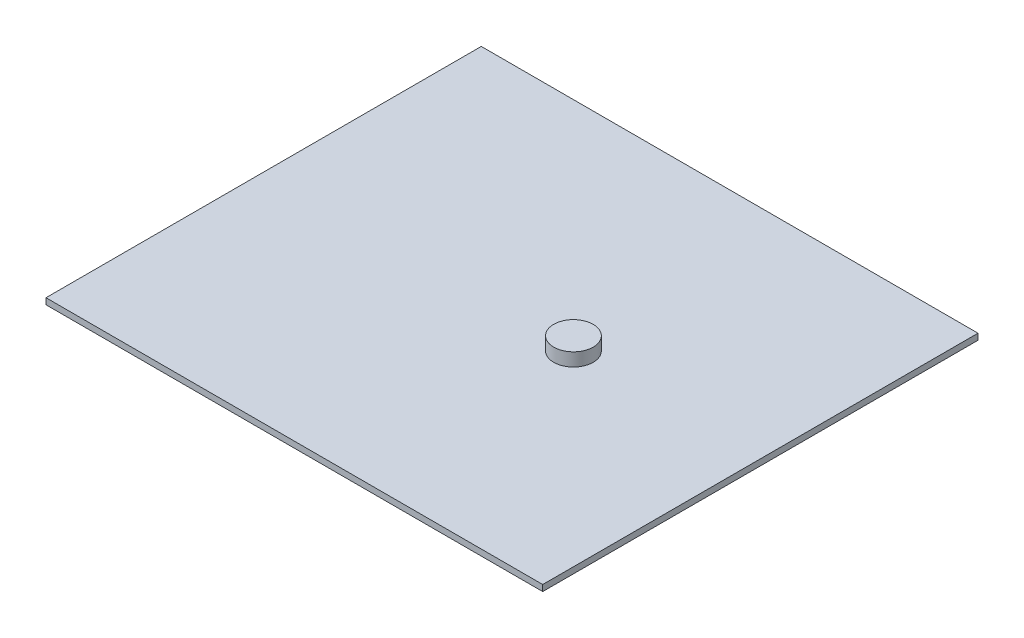
ISO-10303-21;
HEADER;
FILE_DESCRIPTION(('STEP AP214'),'2;1');
FILE_NAME('part.step','',(''),(''),'','','');
FILE_SCHEMA(('AUTOMOTIVE_DESIGN { 1 0 10303 214 1 1 1 1 }'));
ENDSEC;
DATA;
#1=APPLICATION_CONTEXT('core data for automotive mechanical design processes');
#2=APPLICATION_PROTOCOL_DEFINITION('international standard','automotive_design',2000,#1);
#3=PRODUCT_CONTEXT('',#1,'mechanical');
#4=PRODUCT('Part','Part','',(#3));
#5=PRODUCT_RELATED_PRODUCT_CATEGORY('part','',(#4));
#6=PRODUCT_DEFINITION_FORMATION('','',#4);
#7=PRODUCT_DEFINITION_CONTEXT('part definition',#1,'design');
#8=PRODUCT_DEFINITION('design','',#6,#7);
#9=PRODUCT_DEFINITION_SHAPE('','',#8);
#10=(LENGTH_UNIT() NAMED_UNIT(*) SI_UNIT(.MILLI.,.METRE.));
#11=(NAMED_UNIT(*) PLANE_ANGLE_UNIT() SI_UNIT($,.RADIAN.));
#12=(NAMED_UNIT(*) SI_UNIT($,.STERADIAN.) SOLID_ANGLE_UNIT());
#13=UNCERTAINTY_MEASURE_WITH_UNIT(LENGTH_MEASURE(1.E-05),#10,'distance_accuracy_value','');
#14=(GEOMETRIC_REPRESENTATION_CONTEXT(3) GLOBAL_UNCERTAINTY_ASSIGNED_CONTEXT((#13)) GLOBAL_UNIT_ASSIGNED_CONTEXT((#10,
#11,#12)) REPRESENTATION_CONTEXT('',''));
#15=CARTESIAN_POINT('',(0.,0.,0.));
#16=DIRECTION('',(0.,0.,1.));
#17=DIRECTION('',(1.,0.,0.));
#18=AXIS2_PLACEMENT_3D('',#15,#16,#17);
#19=CARTESIAN_POINT('',(-282.94,3.5,247.94));
#20=DIRECTION('',(0.,0.,-1.));
#21=DIRECTION('',(-1.,0.,0.));
#22=AXIS2_PLACEMENT_3D('',#19,#20,#21);
#23=PLANE('',#22);
#24=DIRECTION('',(1.,0.,0.));
#25=VECTOR('',#24,1.);
#26=CARTESIAN_POINT('',(-282.94,-3.5,247.94));
#27=LINE('',#26,#25);
#28=CARTESIAN_POINT('',(-282.94,-3.5,247.94));
#29=VERTEX_POINT('',#28);
#30=CARTESIAN_POINT('',(282.94,-3.5,247.94));
#31=VERTEX_POINT('',#30);
#32=EDGE_CURVE('E106',#29,#31,#27,.T.);
#33=ORIENTED_EDGE('',*,*,#32,.T.);
#34=DIRECTION('',(0.,-1.,0.));
#35=VECTOR('',#34,1.);
#36=CARTESIAN_POINT('',(282.94,3.5,247.94));
#37=LINE('',#36,#35);
#38=CARTESIAN_POINT('',(282.94,3.5,247.94));
#39=VERTEX_POINT('',#38);
#40=EDGE_CURVE('E11',#39,#31,#37,.T.);
#41=ORIENTED_EDGE('',*,*,#40,.F.);
#42=DIRECTION('',(1.,0.,0.));
#43=VECTOR('',#42,1.);
#44=CARTESIAN_POINT('',(-282.94,3.5,247.94));
#45=LINE('',#44,#43);
#46=CARTESIAN_POINT('',(-282.94,3.5,247.94));
#47=VERTEX_POINT('',#46);
#48=EDGE_CURVE('E94',#47,#39,#45,.T.);
#49=ORIENTED_EDGE('',*,*,#48,.F.);
#50=DIRECTION('',(0.,-1.,0.));
#51=VECTOR('',#50,1.);
#52=CARTESIAN_POINT('',(-282.94,3.5,247.94));
#53=LINE('',#52,#51);
#54=EDGE_CURVE('E102',#47,#29,#53,.T.);
#55=ORIENTED_EDGE('',*,*,#54,.T.);
#56=EDGE_LOOP('',(#33,#41,#49,#55));
#57=FACE_BOUND('',#56,.T.);
#58=ADVANCED_FACE('F43',(#57),#23,.F.);
#59=CARTESIAN_POINT('',(282.94,3.5,247.94));
#60=DIRECTION('',(-1.,0.,0.));
#61=DIRECTION('',(0.,0.,1.));
#62=AXIS2_PLACEMENT_3D('',#59,#60,#61);
#63=PLANE('',#62);
#64=DIRECTION('',(0.,0.,-1.));
#65=VECTOR('',#64,1.);
#66=CARTESIAN_POINT('',(282.94,-3.5,247.94));
#67=LINE('',#66,#65);
#68=CARTESIAN_POINT('',(282.94,-3.5,-247.94));
#69=VERTEX_POINT('',#68);
#70=EDGE_CURVE('E98',#31,#69,#67,.T.);
#71=ORIENTED_EDGE('',*,*,#70,.T.);
#72=DIRECTION('',(0.,-1.,0.));
#73=VECTOR('',#72,1.);
#74=CARTESIAN_POINT('',(282.94,3.5,-247.94));
#75=LINE('',#74,#73);
#76=CARTESIAN_POINT('',(282.94,3.5,-247.94));
#77=VERTEX_POINT('',#76);
#78=EDGE_CURVE('E51',#77,#69,#75,.T.);
#79=ORIENTED_EDGE('',*,*,#78,.F.);
#80=DIRECTION('',(0.,0.,-1.));
#81=VECTOR('',#80,1.);
#82=CARTESIAN_POINT('',(282.94,3.5,247.94));
#83=LINE('',#82,#81);
#84=EDGE_CURVE('E89',#39,#77,#83,.T.);
#85=ORIENTED_EDGE('',*,*,#84,.F.);
#86=ORIENTED_EDGE('',*,*,#40,.T.);
#87=EDGE_LOOP('',(#71,#79,#85,#86));
#88=FACE_BOUND('',#87,.T.);
#89=ADVANCED_FACE('F97',(#88),#63,.F.);
#90=CARTESIAN_POINT('',(-282.94,3.5,-247.94));
#91=DIRECTION('',(0.,0.,1.));
#92=DIRECTION('',(1.,0.,0.));
#93=AXIS2_PLACEMENT_3D('',#90,#91,#92);
#94=PLANE('',#93);
#95=DIRECTION('',(-1.,0.,0.));
#96=VECTOR('',#95,1.);
#97=CARTESIAN_POINT('',(-282.94,-3.5,-247.94));
#98=LINE('',#97,#96);
#99=CARTESIAN_POINT('',(-282.94,-3.5,-247.94));
#100=VERTEX_POINT('',#99);
#101=EDGE_CURVE('E76',#69,#100,#98,.T.);
#102=ORIENTED_EDGE('',*,*,#101,.T.);
#103=DIRECTION('',(0.,-1.,0.));
#104=VECTOR('',#103,1.);
#105=CARTESIAN_POINT('',(-282.94,3.5,-247.94));
#106=LINE('',#105,#104);
#107=CARTESIAN_POINT('',(-282.94,3.5,-247.94));
#108=VERTEX_POINT('',#107);
#109=EDGE_CURVE('E99',#108,#100,#106,.T.);
#110=ORIENTED_EDGE('',*,*,#109,.F.);
#111=DIRECTION('',(-1.,0.,0.));
#112=VECTOR('',#111,1.);
#113=CARTESIAN_POINT('',(-282.94,3.5,-247.94));
#114=LINE('',#113,#112);
#115=EDGE_CURVE('E92',#77,#108,#114,.T.);
#116=ORIENTED_EDGE('',*,*,#115,.F.);
#117=ORIENTED_EDGE('',*,*,#78,.T.);
#118=EDGE_LOOP('',(#102,#110,#116,#117));
#119=FACE_BOUND('',#118,.T.);
#120=ADVANCED_FACE('F100',(#119),#94,.F.);
#121=CARTESIAN_POINT('',(-282.94,3.5,247.94));
#122=DIRECTION('',(1.,0.,0.));
#123=DIRECTION('',(0.,0.,-1.));
#124=AXIS2_PLACEMENT_3D('',#121,#122,#123);
#125=PLANE('',#124);
#126=DIRECTION('',(0.,0.,1.));
#127=VECTOR('',#126,1.);
#128=CARTESIAN_POINT('',(-282.94,-3.5,247.94));
#129=LINE('',#128,#127);
#130=EDGE_CURVE('E82',#100,#29,#129,.T.);
#131=ORIENTED_EDGE('',*,*,#130,.T.);
#132=ORIENTED_EDGE('',*,*,#54,.F.);
#133=DIRECTION('',(0.,0.,1.));
#134=VECTOR('',#133,1.);
#135=CARTESIAN_POINT('',(-282.94,3.5,247.94));
#136=LINE('',#135,#134);
#137=EDGE_CURVE('E59',#108,#47,#136,.T.);
#138=ORIENTED_EDGE('',*,*,#137,.F.);
#139=ORIENTED_EDGE('',*,*,#109,.T.);
#140=EDGE_LOOP('',(#131,#132,#138,#139));
#141=FACE_BOUND('',#140,.T.);
#142=ADVANCED_FACE('F114',(#141),#125,.F.);
#143=CARTESIAN_POINT('',(0.,3.5,0.));
#144=DIRECTION('',(0.,1.,0.));
#145=DIRECTION('',(0.,0.,1.));
#146=AXIS2_PLACEMENT_3D('',#143,#144,#145);
#147=PLANE('',#146);
#148=CARTESIAN_POINT('',(70.,3.5,0.));
#149=DIRECTION('',(0.,1.,0.));
#150=DIRECTION('',(0.,0.,1.));
#151=AXIS2_PLACEMENT_3D('',#148,#149,#150);
#152=CIRCLE('',#151,22.5);
#153=CARTESIAN_POINT('',(70.,3.5,22.5));
#154=VERTEX_POINT('',#153);
#155=EDGE_CURVE('E120',#154,#154,#152,.T.);
#156=ORIENTED_EDGE('',*,*,#155,.F.);
#157=EDGE_LOOP('',(#156));
#158=FACE_BOUND('',#157,.T.);
#159=ORIENTED_EDGE('',*,*,#48,.T.);
#160=ORIENTED_EDGE('',*,*,#84,.T.);
#161=ORIENTED_EDGE('',*,*,#115,.T.);
#162=ORIENTED_EDGE('',*,*,#137,.T.);
#163=EDGE_LOOP('',(#159,#160,#161,#162));
#164=FACE_BOUND('',#163,.T.);
#165=ADVANCED_FACE('F90',(#158,#164),#147,.T.);
#166=CARTESIAN_POINT('',(0.,-3.5,0.));
#167=DIRECTION('',(0.,1.,0.));
#168=DIRECTION('',(0.,0.,1.));
#169=AXIS2_PLACEMENT_3D('',#166,#167,#168);
#170=PLANE('',#169);
#171=ORIENTED_EDGE('',*,*,#32,.F.);
#172=ORIENTED_EDGE('',*,*,#130,.F.);
#173=ORIENTED_EDGE('',*,*,#101,.F.);
#174=ORIENTED_EDGE('',*,*,#70,.F.);
#175=EDGE_LOOP('',(#171,#172,#173,#174));
#176=FACE_BOUND('',#175,.T.);
#177=ADVANCED_FACE('F117',(#176),#170,.F.);
#178=CARTESIAN_POINT('',(70.,18.5,0.));
#179=DIRECTION('',(0.,-1.,0.));
#180=DIRECTION('',(0.,0.,-1.));
#181=AXIS2_PLACEMENT_3D('',#178,#179,#180);
#182=CYLINDRICAL_SURFACE('',#181,22.5);
#183=CARTESIAN_POINT('',(70.,18.5,0.));
#184=DIRECTION('',(0.,1.,0.));
#185=DIRECTION('',(0.,0.,1.));
#186=AXIS2_PLACEMENT_3D('',#183,#184,#185);
#187=CIRCLE('',#186,22.5);
#188=CARTESIAN_POINT('',(70.,18.5,22.5));
#189=VERTEX_POINT('',#188);
#190=EDGE_CURVE('E109',#189,#189,#187,.T.);
#191=ORIENTED_EDGE('',*,*,#190,.F.);
#192=EDGE_LOOP('',(#191));
#193=FACE_BOUND('',#192,.T.);
#194=ORIENTED_EDGE('',*,*,#155,.T.);
#195=EDGE_LOOP('',(#194));
#196=FACE_BOUND('',#195,.T.);
#197=ADVANCED_FACE('F128',(#193,#196),#182,.T.);
#198=CARTESIAN_POINT('',(70.,18.5,0.));
#199=DIRECTION('',(0.,1.,0.));
#200=DIRECTION('',(0.,0.,1.));
#201=AXIS2_PLACEMENT_3D('',#198,#199,#200);
#202=PLANE('',#201);
#203=ORIENTED_EDGE('',*,*,#190,.T.);
#204=EDGE_LOOP('',(#203));
#205=FACE_BOUND('',#204,.T.);
#206=ADVANCED_FACE('F126',(#205),#202,.T.);
#207=CLOSED_SHELL('',(#58,#89,#120,#142,#165,#177,#197,#206));
#208=MANIFOLD_SOLID_BREP('B2',#207);
#209=ADVANCED_BREP_SHAPE_REPRESENTATION('',(#18,#208),#14);
#210=SHAPE_DEFINITION_REPRESENTATION(#9,#209);
ENDSEC;
END-ISO-10303-21;
